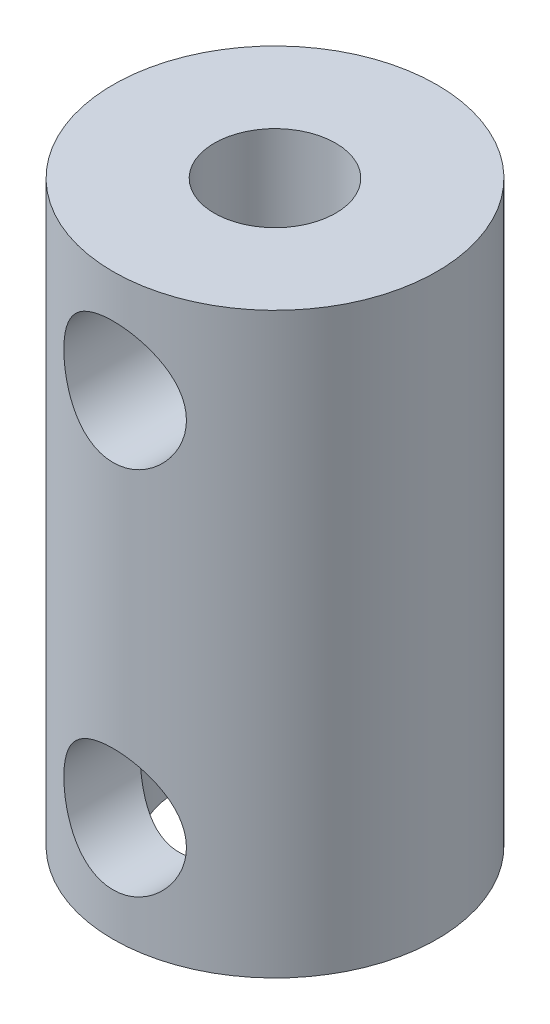
ISO-10303-21;
HEADER;
FILE_DESCRIPTION(('STEP AP214'),'2;1');
FILE_NAME('part.step','',(''),(''),'','','');
FILE_SCHEMA(('AUTOMOTIVE_DESIGN { 1 0 10303 214 1 1 1 1 }'));
ENDSEC;
DATA;
#1=APPLICATION_CONTEXT('core data for automotive mechanical design processes');
#2=APPLICATION_PROTOCOL_DEFINITION('international standard','automotive_design',2000,#1);
#3=PRODUCT_CONTEXT('',#1,'mechanical');
#4=PRODUCT('Part','Part','',(#3));
#5=PRODUCT_RELATED_PRODUCT_CATEGORY('part','',(#4));
#6=PRODUCT_DEFINITION_FORMATION('','',#4);
#7=PRODUCT_DEFINITION_CONTEXT('part definition',#1,'design');
#8=PRODUCT_DEFINITION('design','',#6,#7);
#9=PRODUCT_DEFINITION_SHAPE('','',#8);
#10=(LENGTH_UNIT() NAMED_UNIT(*) SI_UNIT(.MILLI.,.METRE.));
#11=(NAMED_UNIT(*) PLANE_ANGLE_UNIT() SI_UNIT($,.RADIAN.));
#12=(NAMED_UNIT(*) SI_UNIT($,.STERADIAN.) SOLID_ANGLE_UNIT());
#13=UNCERTAINTY_MEASURE_WITH_UNIT(LENGTH_MEASURE(1.E-05),#10,'distance_accuracy_value','');
#14=(GEOMETRIC_REPRESENTATION_CONTEXT(3) GLOBAL_UNCERTAINTY_ASSIGNED_CONTEXT((#13)) GLOBAL_UNIT_ASSIGNED_CONTEXT((#10,
#11,#12)) REPRESENTATION_CONTEXT('',''));
#15=CARTESIAN_POINT('',(0.,0.,0.));
#16=DIRECTION('',(0.,0.,1.));
#17=DIRECTION('',(1.,0.,0.));
#18=AXIS2_PLACEMENT_3D('',#15,#16,#17);
#19=CARTESIAN_POINT('',(0.,19.05,0.));
#20=DIRECTION('',(0.,-1.,0.));
#21=DIRECTION('',(0.,0.,-1.));
#22=AXIS2_PLACEMENT_3D('',#19,#20,#21);
#23=CYLINDRICAL_SURFACE('',#22,5.334);
#24=CARTESIAN_POINT('',(2.0193,3.429,4.93700146951569));
#25=CARTESIAN_POINT('',(2.01930447944566,3.53796644205671,4.93699724405046));
#26=CARTESIAN_POINT('',(2.01045059439056,3.64690370553361,4.94064814854933));
#27=CARTESIAN_POINT('',(1.97543444054488,3.86148882864372,4.95475201963925));
#28=CARTESIAN_POINT('',(1.94927294682313,3.96713683535452,4.96520468163385));
#29=CARTESIAN_POINT('',(1.8807430461981,4.17198278347489,4.99156194094387));
#30=CARTESIAN_POINT('',(1.83841414033231,4.2711957615293,5.00745324054417));
#31=CARTESIAN_POINT('',(1.73889128334471,4.46115102344321,5.04287560500619));
#32=CARTESIAN_POINT('',(1.6816927775262,4.55189070025616,5.06240778458366));
#33=CARTESIAN_POINT('',(1.5509500788627,4.7269220295397,5.10401994332031));
#34=CARTESIAN_POINT('',(1.47677408325426,4.81072382075372,5.12617585427608));
#35=CARTESIAN_POINT('',(1.31552180232293,4.96504478705856,5.16990629793248));
#36=CARTESIAN_POINT('',(1.22844270450761,5.0355610586704,5.19148070266726));
#37=CARTESIAN_POINT('',(1.04012523794396,5.16368183766763,5.23252204526853));
#38=CARTESIAN_POINT('',(0.938499803257829,5.22075210244006,5.25188961400418));
#39=CARTESIAN_POINT('',(0.72622742315813,5.31678227445568,5.28542063488425));
#40=CARTESIAN_POINT('',(0.615583687488669,5.35574859235797,5.29958592879611));
#41=CARTESIAN_POINT('',(0.3935667495427,5.41274137724498,5.32057718322424));
#42=CARTESIAN_POINT('',(0.282438553669901,5.43161158643117,5.32769789450094));
#43=CARTESIAN_POINT('',(0.0583798398278742,5.45058184692518,5.33485652895422));
#44=CARTESIAN_POINT('',(-0.0545500684528995,5.45068811853214,5.33489679931724));
#45=CARTESIAN_POINT('',(-0.272951762873949,5.43261481136873,5.32807636219455));
#46=CARTESIAN_POINT('',(-0.378512558081564,5.41535666378982,5.32156339727964));
#47=CARTESIAN_POINT('',(-0.585111251091151,5.36459681820008,5.30282614548132));
#48=CARTESIAN_POINT('',(-0.686148827388544,5.33109396753274,5.29060145331974));
#49=CARTESIAN_POINT('',(-0.882591199788235,5.24837714092317,5.26142589156488));
#50=CARTESIAN_POINT('',(-0.977891853376846,5.19894029486581,5.24440843901689));
#51=CARTESIAN_POINT('',(-1.15908281530852,5.08595760716204,5.20736477295068));
#52=CARTESIAN_POINT('',(-1.24497004337341,5.02240716770396,5.18733757963256));
#53=CARTESIAN_POINT('',(-1.41031734945089,4.87858128309123,5.1449273066577));
#54=CARTESIAN_POINT('',(-1.48909060289719,4.79753549367529,5.12247495361345));
#55=CARTESIAN_POINT('',(-1.63218972233639,4.623255776233,5.07869327063848));
#56=CARTESIAN_POINT('',(-1.69651181554814,4.53001867543433,5.05736423508365));
#57=CARTESIAN_POINT('',(-1.81023010786301,4.33124303399592,5.01780263958017));
#58=CARTESIAN_POINT('',(-1.85924901990288,4.22547089829707,4.99965257367589));
#59=CARTESIAN_POINT('',(-1.93851753880742,4.00630460921826,4.96945937974622));
#60=CARTESIAN_POINT('',(-1.96877783080307,3.89291483581017,4.95741277583278));
#61=CARTESIAN_POINT('',(-2.0080927254921,3.66852916571396,4.94161372576154));
#62=CARTESIAN_POINT('',(-2.01824049485177,3.55775511724918,4.93743437273379));
#63=CARTESIAN_POINT('',(-2.02020093934924,3.33603239846786,4.93663342024542));
#64=CARTESIAN_POINT('',(-2.01201832383527,3.22508378031911,4.94000987958409));
#65=CARTESIAN_POINT('',(-1.97854205652086,3.01183186914766,4.95350589275915));
#66=CARTESIAN_POINT('',(-1.95410194104481,2.90937078397479,4.96328872527596));
#67=CARTESIAN_POINT('',(-1.88988298600506,2.71005348440489,4.98809328378994));
#68=CARTESIAN_POINT('',(-1.85010096750629,2.61319843639933,5.00311609548081));
#69=CARTESIAN_POINT('',(-1.75463072385412,2.42375373533398,5.03740860205378));
#70=CARTESIAN_POINT('',(-1.69839621410485,2.3314653892027,5.05681781536739));
#71=CARTESIAN_POINT('',(-1.57219523321136,2.15724747101338,5.09746480725639));
#72=CARTESIAN_POINT('',(-1.50222365366067,2.07532177120689,5.11870326441882));
#73=CARTESIAN_POINT('',(-1.34516894631352,1.91864380219287,5.16227937258416));
#74=CARTESIAN_POINT('',(-1.25727058071108,1.84470087388889,5.18459902436317));
#75=CARTESIAN_POINT('',(-1.06976739053701,1.71251372859964,5.22650650196036));
#76=CARTESIAN_POINT('',(-0.970162473418251,1.65426963573486,5.24609430617899));
#77=CARTESIAN_POINT('',(-0.762084546055987,1.55549649159357,5.28032694944767));
#78=CARTESIAN_POINT('',(-0.653639678197273,1.51491364331945,5.29498676788629));
#79=CARTESIAN_POINT('',(-0.430779322695867,1.45280032542776,5.31775366325145));
#80=CARTESIAN_POINT('',(-0.316366729446468,1.43126070903252,5.32586388589444));
#81=CARTESIAN_POINT('',(-0.0921269840688091,1.40884562792457,5.33431446661301));
#82=CARTESIAN_POINT('',(0.0175700260696708,1.40682107157147,5.33508685186249));
#83=CARTESIAN_POINT('',(0.235675890355793,1.42052681410102,5.32990684279753));
#84=CARTESIAN_POINT('',(0.344084903230244,1.43625490180729,5.32395528598201));
#85=CARTESIAN_POINT('',(0.553754325491233,1.48421010250464,5.3061959436016));
#86=CARTESIAN_POINT('',(0.65512610504446,1.5160107376975,5.29453976881732));
#87=CARTESIAN_POINT('',(0.85109980467382,1.594780504935,5.26659215506921));
#88=CARTESIAN_POINT('',(0.945700438435497,1.64175250979097,5.2502998382871));
#89=CARTESIAN_POINT('',(1.12984126460486,1.75179421046231,5.21384686801513));
#90=CARTESIAN_POINT('',(1.21899691290268,1.81546192263802,5.19355150342232));
#91=CARTESIAN_POINT('',(1.38571137675006,1.9561510808879,5.15157869080139));
#92=CARTESIAN_POINT('',(1.46326600313847,2.03317732918966,5.1299007475314));
#93=CARTESIAN_POINT('',(1.60889417238223,2.20334295835457,5.08616858438968));
#94=CARTESIAN_POINT('',(1.67622898493519,2.29712810269221,5.06415732477682));
#95=CARTESIAN_POINT('',(1.79422016325732,2.49537615296483,5.02356822261871));
#96=CARTESIAN_POINT('',(1.84487417660335,2.59984056223187,5.0049908645041));
#97=CARTESIAN_POINT('',(1.92989734602869,2.82239312636753,4.97285117373348));
#98=CARTESIAN_POINT('',(1.96328114135574,2.94090744590317,4.9596003647767));
#99=CARTESIAN_POINT('',(2.00797225124147,3.18262915575414,4.94168088836879));
#100=CARTESIAN_POINT('',(2.01929493679982,3.30583321744351,4.9370062456371));
#101=CARTESIAN_POINT('',(2.0193,3.429,4.93700146951569));
#102=B_SPLINE_CURVE_WITH_KNOTS('',3,(#24,#25,#26,#27,#28,#29,#30,#31,#32,#33,#34,#35,#36,#37,
#38,#39,#40,#41,#42,#43,#44,#45,#46,#47,#48,#49,#50,#51,#52,#53,#54,#55,#56,#57,#58,#59,#60,#61,
#62,#63,#64,#65,#66,#67,#68,#69,#70,#71,#72,#73,#74,#75,#76,#77,#78,#79,#80,#81,#82,#83,#84,#85,
#86,#87,#88,#89,#90,#91,#92,#93,#94,#95,#96,#97,#98,#99,#100,#101),.UNSPECIFIED.,.T.,.F.,(4,2,2,
2,2,2,2,2,2,2,2,2,2,2,2,2,2,2,2,2,2,2,2,2,2,2,2,2,2,2,2,2,2,2,2,2,2,2,4),(0.,0.326440462933107,
0.652866308208244,0.978499662966163,1.30423288001533,1.64497726295524,1.98579602758814,
2.33846601182068,2.69101101924979,3.02808777213957,3.36505278290879,3.68503301877184,
4.00503596242416,4.32972461584071,4.65451919925019,4.9986458272,5.3428621925583,
5.69499486283584,6.0469267694459,6.37913973630184,6.71126736249902,7.02720512429604,
7.34320838551137,7.6712024554679,7.99931872846167,8.34870603281661,8.6980960994686,
9.04641432838321,9.39456516328479,9.72208120206035,10.0495564516543,10.3687657960398,
10.6880356205532,11.0208403418839,11.3537649513074,11.7046787209908,12.0556419573988,
12.4248810015916,12.793862687667),.UNSPECIFIED.);
#103=CARTESIAN_POINT('',(2.0193,3.429,4.93700146951569));
#104=VERTEX_POINT('',#103);
#105=EDGE_CURVE('E91',#104,#104,#102,.T.);
#106=ORIENTED_EDGE('',*,*,#105,.F.);
#107=EDGE_LOOP('',(#106));
#108=FACE_BOUND('',#107,.T.);
#109=CARTESIAN_POINT('',(2.0193,15.621,4.93700146951569));
#110=CARTESIAN_POINT('',(2.01930447944566,15.7299664420567,4.93699724405046));
#111=CARTESIAN_POINT('',(2.01045059439057,15.8389037055336,4.94064814854933));
#112=CARTESIAN_POINT('',(1.97543444054489,16.0534888286437,4.95475201963925));
#113=CARTESIAN_POINT('',(1.94927294682312,16.1591368353545,4.96520468163385));
#114=CARTESIAN_POINT('',(1.88074304619809,16.3639827834749,4.99156194094387));
#115=CARTESIAN_POINT('',(1.83841414033231,16.4631957615293,5.00745324054417));
#116=CARTESIAN_POINT('',(1.73889128334471,16.6531510234432,5.04287560500619));
#117=CARTESIAN_POINT('',(1.6816927775262,16.7438907002562,5.06240778458366));
#118=CARTESIAN_POINT('',(1.5509500788627,16.9189220295397,5.10401994332031));
#119=CARTESIAN_POINT('',(1.47677408325426,17.0027238207537,5.12617585427608));
#120=CARTESIAN_POINT('',(1.31552180232293,17.1570447870586,5.16990629793248));
#121=CARTESIAN_POINT('',(1.22844270450761,17.2275610586704,5.19148070266726));
#122=CARTESIAN_POINT('',(1.04012523794396,17.3556818376676,5.23252204526853));
#123=CARTESIAN_POINT('',(0.938499803257829,17.41275210244,5.25188961400418));
#124=CARTESIAN_POINT('',(0.72622742315813,17.5087822744557,5.28542063488425));
#125=CARTESIAN_POINT('',(0.615583687488669,17.547748592358,5.29958592879611));
#126=CARTESIAN_POINT('',(0.393566749542701,17.604741377245,5.32057718322424));
#127=CARTESIAN_POINT('',(0.282438553669903,17.6236115864312,5.32769789450094));
#128=CARTESIAN_POINT('',(0.0583798398278784,17.6425818469252,5.33485652895422));
#129=CARTESIAN_POINT('',(-0.0545500684528942,17.6426881185321,5.33489679931724));
#130=CARTESIAN_POINT('',(-0.272951762873941,17.6246148113687,5.32807636219455));
#131=CARTESIAN_POINT('',(-0.378512558081556,17.6073566637898,5.32156339727964));
#132=CARTESIAN_POINT('',(-0.585111251091143,17.5565968182001,5.30282614548132));
#133=CARTESIAN_POINT('',(-0.686148827388537,17.5230939675327,5.29060145331974));
#134=CARTESIAN_POINT('',(-0.882591199788228,17.4403771409232,5.26142589156488));
#135=CARTESIAN_POINT('',(-0.977891853376836,17.3909402948658,5.2444084390169));
#136=CARTESIAN_POINT('',(-1.15908281530851,17.277957607162,5.20736477295068));
#137=CARTESIAN_POINT('',(-1.24497004337341,17.214407167704,5.18733757963256));
#138=CARTESIAN_POINT('',(-1.41031734945088,17.0705812830912,5.1449273066577));
#139=CARTESIAN_POINT('',(-1.48909060289718,16.9895354936753,5.12247495361345));
#140=CARTESIAN_POINT('',(-1.63218972233638,16.815255776233,5.07869327063848));
#141=CARTESIAN_POINT('',(-1.69651181554813,16.7220186754343,5.05736423508365));
#142=CARTESIAN_POINT('',(-1.810230107863,16.5232430339959,5.01780263958017));
#143=CARTESIAN_POINT('',(-1.85924901990287,16.4174708982971,4.9996525736759));
#144=CARTESIAN_POINT('',(-1.9385175388074,16.1983046092183,4.96945937974623));
#145=CARTESIAN_POINT('',(-1.96877783080306,16.0849148358102,4.95741277583277));
#146=CARTESIAN_POINT('',(-2.00809272549209,15.860529165714,4.94161372576153));
#147=CARTESIAN_POINT('',(-2.01824049485176,15.7497551172492,4.9374343727338));
#148=CARTESIAN_POINT('',(-2.02020093934923,15.5280323984679,4.93663342024543));
#149=CARTESIAN_POINT('',(-2.01201832383527,15.4170837803191,4.94000987958409));
#150=CARTESIAN_POINT('',(-1.97854205652086,15.2038318691477,4.95350589275915));
#151=CARTESIAN_POINT('',(-1.95410194104481,15.1013707839748,4.96328872527596));
#152=CARTESIAN_POINT('',(-1.88988298600505,14.9020534844049,4.98809328378995));
#153=CARTESIAN_POINT('',(-1.85010096750628,14.8051984363993,5.00311609548082));
#154=CARTESIAN_POINT('',(-1.75463072385411,14.615753735334,5.03740860205378));
#155=CARTESIAN_POINT('',(-1.69839621410485,14.5234653892027,5.05681781536739));
#156=CARTESIAN_POINT('',(-1.57219523321136,14.3492474710134,5.09746480725639));
#157=CARTESIAN_POINT('',(-1.50222365366066,14.2673217712069,5.11870326441882));
#158=CARTESIAN_POINT('',(-1.34516894631352,14.1106438021929,5.16227937258415));
#159=CARTESIAN_POINT('',(-1.25727058071108,14.0367008738889,5.18459902436317));
#160=CARTESIAN_POINT('',(-1.06976739053702,13.9045137285996,5.22650650196036));
#161=CARTESIAN_POINT('',(-0.97016247341825,13.8462696357349,5.24609430617899));
#162=CARTESIAN_POINT('',(-0.762084546055986,13.7474964915936,5.28032694944767));
#163=CARTESIAN_POINT('',(-0.653639678197273,13.7069136433194,5.29498676788628));
#164=CARTESIAN_POINT('',(-0.430779322695865,13.6448003254278,5.31775366325145));
#165=CARTESIAN_POINT('',(-0.316366729446463,13.6232607090325,5.32586388589444));
#166=CARTESIAN_POINT('',(-0.0921269840688006,13.6008456279246,5.33431446661301));
#167=CARTESIAN_POINT('',(0.01757002606968,13.5988210715715,5.33508685186249));
#168=CARTESIAN_POINT('',(0.235675890355801,13.612526814101,5.32990684279753));
#169=CARTESIAN_POINT('',(0.344084903230251,13.6282549018073,5.32395528598201));
#170=CARTESIAN_POINT('',(0.55375432549124,13.6762101025046,5.3061959436016));
#171=CARTESIAN_POINT('',(0.655126105044469,13.7080107376975,5.29453976881732));
#172=CARTESIAN_POINT('',(0.85109980467383,13.786780504935,5.26659215506921));
#173=CARTESIAN_POINT('',(0.945700438435504,13.833752509791,5.25029983828711));
#174=CARTESIAN_POINT('',(1.12984126460487,13.9437942104623,5.21384686801514));
#175=CARTESIAN_POINT('',(1.21899691290269,14.007461922638,5.19355150342232));
#176=CARTESIAN_POINT('',(1.38571137675007,14.1481510808879,5.15157869080139));
#177=CARTESIAN_POINT('',(1.46326600313847,14.2251773291897,5.1299007475314));
#178=CARTESIAN_POINT('',(1.60889417238223,14.3953429583546,5.08616858438968));
#179=CARTESIAN_POINT('',(1.6762289849352,14.4891281026922,5.06415732477682));
#180=CARTESIAN_POINT('',(1.79422016325732,14.6873761529648,5.0235682226187));
#181=CARTESIAN_POINT('',(1.84487417660335,14.7918405622319,5.0049908645041));
#182=CARTESIAN_POINT('',(1.92989734602869,15.0143931263675,4.97285117373349));
#183=CARTESIAN_POINT('',(1.96328114135574,15.1329074459032,4.9596003647767));
#184=CARTESIAN_POINT('',(2.00797225124147,15.3746291557541,4.94168088836878));
#185=CARTESIAN_POINT('',(2.01929493679982,15.4978332174435,4.9370062456371));
#186=CARTESIAN_POINT('',(2.0193,15.621,4.93700146951569));
#187=B_SPLINE_CURVE_WITH_KNOTS('',3,(#109,#110,#111,#112,#113,#114,#115,#116,#117,#118,#119,
#120,#121,#122,#123,#124,#125,#126,#127,#128,#129,#130,#131,#132,#133,#134,#135,#136,#137,#138,
#139,#140,#141,#142,#143,#144,#145,#146,#147,#148,#149,#150,#151,#152,#153,#154,#155,#156,#157,
#158,#159,#160,#161,#162,#163,#164,#165,#166,#167,#168,#169,#170,#171,#172,#173,#174,#175,#176,
#177,#178,#179,#180,#181,#182,#183,#184,#185,#186),.UNSPECIFIED.,.T.,.F.,(4,2,2,2,2,2,2,2,2,2,2,
2,2,2,2,2,2,2,2,2,2,2,2,2,2,2,2,2,2,2,2,2,2,2,2,2,2,2,4),(0.,0.326440462933105,
0.652866308208246,0.978499662966168,1.30423288001533,1.64497726295524,1.98579602758814,
2.33846601182068,2.69101101924979,3.02808777213956,3.36505278290879,3.68503301877183,
4.00503596242416,4.3297246158407,4.65451919925018,4.99864582719998,5.34286219255828,
5.69499486283583,6.04692676944589,6.37913973630183,6.71126736249899,7.02720512429603,
7.34320838551137,7.67120245546788,7.99931872846165,8.34870603281659,8.69809609946858,
9.04641432838319,9.39456516328478,9.72208120206033,10.0495564516543,10.3687657960398,
10.6880356205532,11.0208403418838,11.3537649513074,11.7046787209907,12.0556419573988,
12.4248810015916,12.793862687667),.UNSPECIFIED.);
#188=CARTESIAN_POINT('',(2.0193,15.621,4.93700146951569));
#189=VERTEX_POINT('',#188);
#190=EDGE_CURVE('E120',#189,#189,#187,.T.);
#191=ORIENTED_EDGE('',*,*,#190,.F.);
#192=EDGE_LOOP('',(#191));
#193=FACE_BOUND('',#192,.T.);
#194=CARTESIAN_POINT('',(0.,19.05,0.));
#195=DIRECTION('',(0.,-1.,0.));
#196=DIRECTION('',(0.,0.,-1.));
#197=AXIS2_PLACEMENT_3D('',#194,#195,#196);
#198=CIRCLE('',#197,5.334);
#199=CARTESIAN_POINT('',(0.,19.05,-5.334));
#200=VERTEX_POINT('',#199);
#201=EDGE_CURVE('E87',#200,#200,#198,.T.);
#202=ORIENTED_EDGE('',*,*,#201,.T.);
#203=EDGE_LOOP('',(#202));
#204=FACE_BOUND('',#203,.T.);
#205=CARTESIAN_POINT('',(0.,0.,0.));
#206=DIRECTION('',(0.,-1.,0.));
#207=DIRECTION('',(0.,0.,-1.));
#208=AXIS2_PLACEMENT_3D('',#205,#206,#207);
#209=CIRCLE('',#208,5.334);
#210=CARTESIAN_POINT('',(0.,0.,-5.334));
#211=VERTEX_POINT('',#210);
#212=EDGE_CURVE('E143',#211,#211,#209,.T.);
#213=ORIENTED_EDGE('',*,*,#212,.F.);
#214=EDGE_LOOP('',(#213));
#215=FACE_BOUND('',#214,.T.);
#216=ADVANCED_FACE('F42',(#108,#193,#204,#215),#23,.T.);
#217=CARTESIAN_POINT('',(5.334,19.05,0.));
#218=DIRECTION('',(0.,1.,0.));
#219=DIRECTION('',(0.,0.,1.));
#220=AXIS2_PLACEMENT_3D('',#217,#218,#219);
#221=PLANE('',#220);
#222=CARTESIAN_POINT('',(0.,19.05,0.));
#223=DIRECTION('',(0.,-1.,0.));
#224=DIRECTION('',(0.,0.,-1.));
#225=AXIS2_PLACEMENT_3D('',#222,#223,#224);
#226=CIRCLE('',#225,2.);
#227=CARTESIAN_POINT('',(0.,19.05,-2.));
#228=VERTEX_POINT('',#227);
#229=EDGE_CURVE('E140',#228,#228,#226,.T.);
#230=ORIENTED_EDGE('',*,*,#229,.T.);
#231=EDGE_LOOP('',(#230));
#232=FACE_BOUND('',#231,.T.);
#233=ORIENTED_EDGE('',*,*,#201,.F.);
#234=EDGE_LOOP('',(#233));
#235=FACE_BOUND('',#234,.T.);
#236=ADVANCED_FACE('F154',(#232,#235),#221,.T.);
#237=CARTESIAN_POINT('',(0.,0.,0.));
#238=DIRECTION('',(0.,-1.,0.));
#239=DIRECTION('',(0.,0.,-1.));
#240=AXIS2_PLACEMENT_3D('',#237,#238,#239);
#241=PLANE('',#240);
#242=CARTESIAN_POINT('',(0.,0.,0.));
#243=DIRECTION('',(0.,-1.,0.));
#244=DIRECTION('',(0.,0.,-1.));
#245=AXIS2_PLACEMENT_3D('',#242,#243,#244);
#246=CIRCLE('',#245,3.17499999999999);
#247=CARTESIAN_POINT('',(0.,0.,-3.17499999999999));
#248=VERTEX_POINT('',#247);
#249=EDGE_CURVE('E127',#248,#248,#246,.T.);
#250=ORIENTED_EDGE('',*,*,#249,.F.);
#251=EDGE_LOOP('',(#250));
#252=FACE_BOUND('',#251,.T.);
#253=ORIENTED_EDGE('',*,*,#212,.T.);
#254=EDGE_LOOP('',(#253));
#255=FACE_BOUND('',#254,.T.);
#256=ADVANCED_FACE('F156',(#252,#255),#241,.T.);
#257=CARTESIAN_POINT('',(0.,0.,0.));
#258=DIRECTION('',(0.,-1.,0.));
#259=DIRECTION('',(0.,0.,-1.));
#260=AXIS2_PLACEMENT_3D('',#257,#258,#259);
#261=CYLINDRICAL_SURFACE('',#260,2.00000000000001);
#262=DIRECTION('',(0.,-1.,0.));
#263=VECTOR('',#262,1.);
#264=CARTESIAN_POINT('',(-2.,0.,0.));
#265=LINE('',#264,#263);
#266=CARTESIAN_POINT('',(-1.99999999999999,15.8995183835942,0.));
#267=VERTEX_POINT('',#266);
#268=CARTESIAN_POINT('',(-1.99999999999999,15.3424816164058,0.));
#269=VERTEX_POINT('',#268);
#270=EDGE_CURVE('E86',#267,#269,#265,.T.);
#271=ORIENTED_EDGE('',*,*,#270,.T.);
#272=CARTESIAN_POINT('',(-1.99999999999999,15.3424816164058,0.));
#273=CARTESIAN_POINT('',(-2.00000748831822,15.342587271666,0.0192077634751876));
#274=CARTESIAN_POINT('',(-1.9997243945891,15.3404974577202,0.0382328395349654));
#275=CARTESIAN_POINT('',(-1.99866755441006,15.3330384444102,0.0751799827838716));
#276=CARTESIAN_POINT('',(-1.99790543999761,15.3277470984996,0.0931174412164273));
#277=CARTESIAN_POINT('',(-1.99485746057193,15.3074823773858,0.148286783167819));
#278=CARTESIAN_POINT('',(-1.99182861163326,15.2883879226125,0.183849680609768));
#279=CARTESIAN_POINT('',(-1.98426929244277,15.2458434932975,0.252780344942273));
#280=CARTESIAN_POINT('',(-1.97970824187665,15.2223094867289,0.286085302255442));
#281=CARTESIAN_POINT('',(-1.96911335877789,15.172874016039,0.351729844098035));
#282=CARTESIAN_POINT('',(-1.96305176914157,15.1469344774164,0.384036574645022));
#283=CARTESIAN_POINT('',(-1.94954358636357,15.0941221923492,0.447586887168161));
#284=CARTESIAN_POINT('',(-1.94209608887332,15.0672488459313,0.47882975910476));
#285=CARTESIAN_POINT('',(-1.91766272931993,14.9859088355922,0.571549324042008));
#286=CARTESIAN_POINT('',(-1.89860114147255,14.9307960516994,0.631925909200008));
#287=CARTESIAN_POINT('',(-1.85498638337458,14.8209453888143,0.750311764928943));
#288=CARTESIAN_POINT('',(-1.83046495388365,14.7662071555184,0.808332514384589));
#289=CARTESIAN_POINT('',(-1.77571877659275,14.6576264974823,0.92240111657699));
#290=CARTESIAN_POINT('',(-1.74549870522666,14.6037833773399,0.978450542590948));
#291=CARTESIAN_POINT('',(-1.67884853394249,14.4971570314943,1.08887772520683));
#292=CARTESIAN_POINT('',(-1.64237059897694,14.444385760751,1.14323848139825));
#293=CARTESIAN_POINT('',(-1.56315103636863,14.3410066139392,1.24938164321234));
#294=CARTESIAN_POINT('',(-1.52040676394172,14.2903996630555,1.30116294772112));
#295=CARTESIAN_POINT('',(-1.38247778031107,14.1430405024795,1.45162211365199));
#296=CARTESIAN_POINT('',(-1.27736716309543,14.0503661508649,1.54581021002994));
#297=CARTESIAN_POINT('',(-1.08814511089191,13.9177852433471,1.68030753313403));
#298=CARTESIAN_POINT('',(-1.01279273609853,13.8717166299401,1.72698046896826));
#299=CARTESIAN_POINT('',(-0.85269727011424,13.7883513458444,1.81137325333855));
#300=CARTESIAN_POINT('',(-0.767960780205621,13.7510485657521,1.84909933760977));
#301=CARTESIAN_POINT('',(-0.589342936559108,13.6872667277984,1.91357622366881));
#302=CARTESIAN_POINT('',(-0.495374516107187,13.6609060433235,1.94020700556301));
#303=CARTESIAN_POINT('',(-0.301829106896712,13.6219581332061,1.97954636705079));
#304=CARTESIAN_POINT('',(-0.202259824195108,13.6093524473856,1.99227360620528));
#305=CARTESIAN_POINT('',(-0.0165737953527124,13.5999539335568,2.00176294174565));
#306=CARTESIAN_POINT('',(0.0693393795394252,13.6010867376299,2.00061937971779));
#307=CARTESIAN_POINT('',(0.239480596384862,13.6141378547581,1.98744158063111));
#308=CARTESIAN_POINT('',(0.323708726173339,13.6260556041288,1.97540791275306));
#309=CARTESIAN_POINT('',(0.483518112448736,13.6588375976378,1.94229604141942));
#310=CARTESIAN_POINT('',(0.559320439566745,13.6791787564111,1.92174661196922));
#311=CARTESIAN_POINT('',(0.705790095057259,13.727487450853,1.87292008503527));
#312=CARTESIAN_POINT('',(0.776455639693814,13.7554576198069,1.84464031928429));
#313=CARTESIAN_POINT('',(0.940455995761938,13.830931464341,1.7682817701587));
#314=CARTESIAN_POINT('',(1.03075165062372,13.8816948996274,1.71688631336408));
#315=CARTESIAN_POINT('',(1.19850532971888,13.9927090019766,1.60432032335271));
#316=CARTESIAN_POINT('',(1.27593463286973,14.0529803241363,1.54312850395108));
#317=CARTESIAN_POINT('',(1.44503742040652,14.2044099786752,1.38904372124749));
#318=CARTESIAN_POINT('',(1.53103298904051,14.2986321884123,1.29291066556784));
#319=CARTESIAN_POINT('',(1.64308682211231,14.4455652201976,1.1420161031596));
#320=CARTESIAN_POINT('',(1.6776439697679,14.4955351947379,1.09054077679252));
#321=CARTESIAN_POINT('',(1.74134672627516,14.5968619144876,0.985634221691187));
#322=CARTESIAN_POINT('',(1.77049398667466,14.6482182309679,0.932203595860018));
#323=CARTESIAN_POINT('',(1.81713565077218,14.739219708464,0.836730312591955));
#324=CARTESIAN_POINT('',(1.83574345674735,14.7786934351685,0.795058568758477));
#325=CARTESIAN_POINT('',(1.87002880929561,14.857834086355,0.710681090115651));
#326=CARTESIAN_POINT('',(1.88570574367889,14.8975010494281,0.667975141384794));
#327=CARTESIAN_POINT('',(1.91413894714902,14.97648203236,0.581496882574795));
#328=CARTESIAN_POINT('',(1.92690238637382,15.0157966848282,0.537727490212924));
#329=CARTESIAN_POINT('',(1.94958114684418,15.0934344072027,0.448616973422525));
#330=CARTESIAN_POINT('',(1.95949852629816,15.1317581753521,0.403277011524337));
#331=CARTESIAN_POINT('',(1.97277362889247,15.1894892320285,0.32997977941102));
#332=CARTESIAN_POINT('',(1.97711241488193,15.2099029944993,0.302995132253033));
#333=CARTESIAN_POINT('',(1.98482505218745,15.2489358146375,0.247506020198399));
#334=CARTESIAN_POINT('',(1.98819764959178,15.2675525195204,0.218999636781018));
#335=CARTESIAN_POINT('',(1.99282475383879,15.2948997370007,0.170329630728768));
#336=CARTESIAN_POINT('',(1.9944047067489,15.3047768044837,0.150856173469314));
#337=CARTESIAN_POINT('',(1.99702870184641,15.3217970735771,0.11079128176629));
#338=CARTESIAN_POINT('',(1.99807638915548,15.3289587825933,0.0902085493917273));
#339=CARTESIAN_POINT('',(1.9991946966965,15.3367442614378,0.0578519042516144));
#340=CARTESIAN_POINT('',(1.99949311852767,15.3388594043234,0.0464499657473986));
#341=CARTESIAN_POINT('',(1.9998974216306,15.341744795786,0.0233737220268201));
#342=CARTESIAN_POINT('',(2.00000156481852,15.3425029014292,0.0116978956015704));
#343=CARTESIAN_POINT('',(2.00000000000001,15.3424816164058,0.));
#344=B_SPLINE_CURVE_WITH_KNOTS('',3,(#272,#273,#274,#275,#276,#277,#278,#279,#280,#281,#282,
#283,#284,#285,#286,#287,#288,#289,#290,#291,#292,#293,#294,#295,#296,#297,#298,#299,#300,#301,
#302,#303,#304,#305,#306,#307,#308,#309,#310,#311,#312,#313,#314,#315,#316,#317,#318,#319,#320,
#321,#322,#323,#324,#325,#326,#327,#328,#329,#330,#331,#332,#333,#334,#335,#336,#337,#338,#339,
#340,#341,#342,#343),.UNSPECIFIED.,.F.,.F.,(4,2,2,2,2,2,2,2,2,2,2,2,2,2,2,2,2,2,2,2,2,2,2,2,2,2,
2,2,2,2,2,2,2,2,2,4),(0.,0.0572212196873636,0.113103945109736,0.233594332403711,
0.356648526209319,0.482175813106861,0.607785299579433,0.859357941597184,1.10950457759485,
1.35944682397225,1.61139248897477,1.86344479850475,2.36578118786238,2.66449162617641,
2.96299325474961,3.26464487824174,3.56589116416417,3.82229894685731,4.07869332895043,
4.32111164705779,4.56361374617905,4.90859052703501,5.25432733236246,5.73074334288402,
5.96948577941364,6.20815521156947,6.38910474555767,6.57009203350265,6.75062898909158,
6.93103505336674,7.03333696410983,7.1357710461502,7.20133615895784,7.26644599507595,
7.30116939437312,7.33620197844745),.UNSPECIFIED.);
#345=CARTESIAN_POINT('',(2.00000000000001,15.3424816164058,0.));
#346=VERTEX_POINT('',#345);
#347=EDGE_CURVE('E11',#269,#346,#344,.T.);
#348=ORIENTED_EDGE('',*,*,#347,.T.);
#349=DIRECTION('',(0.,-1.,0.));
#350=VECTOR('',#349,1.);
#351=CARTESIAN_POINT('',(2.,0.,0.));
#352=LINE('',#351,#350);
#353=CARTESIAN_POINT('',(2.00000000000001,15.8995183835942,0.));
#354=VERTEX_POINT('',#353);
#355=EDGE_CURVE('E57',#346,#354,#352,.F.);
#356=ORIENTED_EDGE('',*,*,#355,.T.);
#357=CARTESIAN_POINT('',(2.00000000000001,15.8995183835942,0.));
#358=CARTESIAN_POINT('',(2.00000748831821,15.8994127283341,0.0192077634751675));
#359=CARTESIAN_POINT('',(1.9997243945891,15.9015025422799,0.0382328395349459));
#360=CARTESIAN_POINT('',(1.99866755441007,15.9089615555899,0.0751799827838645));
#361=CARTESIAN_POINT('',(1.99790543999763,15.9142529015004,0.0931174412164318));
#362=CARTESIAN_POINT('',(1.99485746057196,15.9345176226142,0.14828678316783));
#363=CARTESIAN_POINT('',(1.99182861163327,15.9536120773876,0.183849680609743));
#364=CARTESIAN_POINT('',(1.98426929244276,15.9961565067026,0.25278034494224));
#365=CARTESIAN_POINT('',(1.97970824187666,16.0196905132711,0.286085302255439));
#366=CARTESIAN_POINT('',(1.96911335877791,16.069125983961,0.351729844098036));
#367=CARTESIAN_POINT('',(1.96305176914158,16.0950655225836,0.384036574644996));
#368=CARTESIAN_POINT('',(1.94954358636358,16.1478778076508,0.447586887168114));
#369=CARTESIAN_POINT('',(1.94209608887333,16.1747511540687,0.478829759104721));
#370=CARTESIAN_POINT('',(1.91766272931994,16.2560911644078,0.571549324041987));
#371=CARTESIAN_POINT('',(1.89860114147256,16.3112039483006,0.631925909199987));
#372=CARTESIAN_POINT('',(1.85498638337458,16.4210546111857,0.750311764928928));
#373=CARTESIAN_POINT('',(1.83046495388365,16.4757928444816,0.808332514384579));
#374=CARTESIAN_POINT('',(1.77571877659275,16.5843735025177,0.922401116576983));
#375=CARTESIAN_POINT('',(1.74549870522666,16.6382166226601,0.978450542590941));
#376=CARTESIAN_POINT('',(1.6788485339425,16.7448429685057,1.08887772520683));
#377=CARTESIAN_POINT('',(1.64237059897695,16.797614239249,1.14323848139825));
#378=CARTESIAN_POINT('',(1.56315103636863,16.9009933860608,1.24938164321234));
#379=CARTESIAN_POINT('',(1.52040676394173,16.9516003369445,1.30116294772112));
#380=CARTESIAN_POINT('',(1.38247778031108,17.0989594975205,1.45162211365199));
#381=CARTESIAN_POINT('',(1.27736716309545,17.1916338491351,1.54581021002994));
#382=CARTESIAN_POINT('',(1.08814511089192,17.3242147566529,1.68030753313403));
#383=CARTESIAN_POINT('',(1.01279273609854,17.3702833700599,1.72698046896826));
#384=CARTESIAN_POINT('',(0.852697270114247,17.4536486541556,1.81137325333854));
#385=CARTESIAN_POINT('',(0.767960780205633,17.4909514342479,1.84909933760977));
#386=CARTESIAN_POINT('',(0.589342936559122,17.5547332722016,1.91357622366881));
#387=CARTESIAN_POINT('',(0.495374516107196,17.5810939566765,1.94020700556301));
#388=CARTESIAN_POINT('',(0.301829106896717,17.6200418667939,1.97954636705079));
#389=CARTESIAN_POINT('',(0.202259824195114,17.6326475526144,1.99227360620528));
#390=CARTESIAN_POINT('',(0.0165737953527205,17.6420460664432,2.00176294174565));
#391=CARTESIAN_POINT('',(-0.0693393795394165,17.6409132623701,2.00061937971779));
#392=CARTESIAN_POINT('',(-0.239480596384855,17.6278621452419,1.98744158063111));
#393=CARTESIAN_POINT('',(-0.323708726173333,17.6159443958712,1.97540791275306));
#394=CARTESIAN_POINT('',(-0.483518112448727,17.5831624023622,1.94229604141942));
#395=CARTESIAN_POINT('',(-0.559320439566733,17.5628212435888,1.92174661196923));
#396=CARTESIAN_POINT('',(-0.705790095057244,17.514512549147,1.87292008503527));
#397=CARTESIAN_POINT('',(-0.776455639693801,17.4865423801931,1.8446403192843));
#398=CARTESIAN_POINT('',(-0.940455995761927,17.4110685356591,1.76828177015871));
#399=CARTESIAN_POINT('',(-1.03075165062371,17.3603051003726,1.71688631336409));
#400=CARTESIAN_POINT('',(-1.19850532971886,17.2492909980234,1.60432032335272));
#401=CARTESIAN_POINT('',(-1.27593463286971,17.1890196758637,1.54312850395108));
#402=CARTESIAN_POINT('',(-1.4450374204065,17.0375900213248,1.38904372124749));
#403=CARTESIAN_POINT('',(-1.5310329890405,16.9433678115877,1.29291066556784));
#404=CARTESIAN_POINT('',(-1.6430868221123,16.7964347798024,1.14201610315962));
#405=CARTESIAN_POINT('',(-1.6776439697679,16.7464648052621,1.09054077679254));
#406=CARTESIAN_POINT('',(-1.74134672627515,16.6451380855124,0.985634221691196));
#407=CARTESIAN_POINT('',(-1.77049398667464,16.5937817690321,0.932203595860016));
#408=CARTESIAN_POINT('',(-1.81713565077217,16.502780291536,0.836730312591957));
#409=CARTESIAN_POINT('',(-1.83574345674734,16.4633065648315,0.79505856875849));
#410=CARTESIAN_POINT('',(-1.87002880929561,16.384165913645,0.710681090115671));
#411=CARTESIAN_POINT('',(-1.88570574367889,16.3444989505719,0.66797514138481));
#412=CARTESIAN_POINT('',(-1.91413894714901,16.26551796764,0.581496882574825));
#413=CARTESIAN_POINT('',(-1.92690238637381,16.2262033151718,0.537727490212971));
#414=CARTESIAN_POINT('',(-1.94958114684417,16.1485655927973,0.448616973422546));
#415=CARTESIAN_POINT('',(-1.95949852629815,16.1102418246479,0.403277011524316));
#416=CARTESIAN_POINT('',(-1.97277362889246,16.0525107679715,0.329979779411034));
#417=CARTESIAN_POINT('',(-1.97711241488193,16.0320970055006,0.302995132253082));
#418=CARTESIAN_POINT('',(-1.98482505218745,15.9930641853625,0.247506020198439));
#419=CARTESIAN_POINT('',(-1.98819764959177,15.9744474804796,0.218999636781013));
#420=CARTESIAN_POINT('',(-1.99282475383878,15.9471002629992,0.17032963072878));
#421=CARTESIAN_POINT('',(-1.9944047067489,15.9372231955162,0.150856173469353));
#422=CARTESIAN_POINT('',(-1.99702870184641,15.9202029264229,0.110791281766321));
#423=CARTESIAN_POINT('',(-1.99807638915547,15.9130412174068,0.0902085493917228));
#424=CARTESIAN_POINT('',(-1.9991946966965,15.9052557385622,0.0578519042516082));
#425=CARTESIAN_POINT('',(-1.99949311852767,15.9031405956765,0.0464499657474026));
#426=CARTESIAN_POINT('',(-1.99989742163061,15.9002552042139,0.0233737220268356));
#427=CARTESIAN_POINT('',(-2.00000156481852,15.8994970985707,0.0116978956015872));
#428=CARTESIAN_POINT('',(-1.99999999999999,15.8995183835942,0.));
#429=B_SPLINE_CURVE_WITH_KNOTS('',3,(#357,#358,#359,#360,#361,#362,#363,#364,#365,#366,#367,
#368,#369,#370,#371,#372,#373,#374,#375,#376,#377,#378,#379,#380,#381,#382,#383,#384,#385,#386,
#387,#388,#389,#390,#391,#392,#393,#394,#395,#396,#397,#398,#399,#400,#401,#402,#403,#404,#405,
#406,#407,#408,#409,#410,#411,#412,#413,#414,#415,#416,#417,#418,#419,#420,#421,#422,#423,#424,
#425,#426,#427,#428),.UNSPECIFIED.,.F.,.F.,(4,2,2,2,2,2,2,2,2,2,2,2,2,2,2,2,2,2,2,2,2,2,2,2,2,2,
2,2,2,2,2,2,2,2,2,4),(0.,0.0572212196873587,0.113103945109727,0.233594332403691,
0.356648526209289,0.482175813106817,0.607785299579384,0.859357941597157,1.10950457759483,
1.35944682397222,1.61139248897473,1.86344479850472,2.36578118786235,2.66449162617638,
2.96299325474958,3.26464487824171,3.56589116416415,3.82229894685728,4.07869332895041,
4.32111164705776,4.56361374617902,4.90859052703498,5.25432733236244,5.73074334288399,
5.96948577941361,6.20815521156944,6.38910474555764,6.57009203350262,6.75062898909154,
6.93103505336671,7.03333696410979,7.13577104615017,7.20133615895782,7.26644599507594,
7.30116939437312,7.33620197844746),.UNSPECIFIED.);
#430=EDGE_CURVE('E80',#354,#267,#429,.T.);
#431=ORIENTED_EDGE('',*,*,#430,.T.);
#432=EDGE_LOOP('',(#271,#348,#356,#431));
#433=FACE_BOUND('',#432,.T.);
#434=ORIENTED_EDGE('',*,*,#229,.F.);
#435=EDGE_LOOP('',(#434));
#436=FACE_BOUND('',#435,.T.);
#437=CARTESIAN_POINT('',(0.,10.2310112273003,0.));
#438=DIRECTION('',(0.,-1.,0.));
#439=DIRECTION('',(0.,0.,-1.));
#440=AXIS2_PLACEMENT_3D('',#437,#438,#439);
#441=CIRCLE('',#440,2.00000000000001);
#442=CARTESIAN_POINT('',(0.,10.2310112273003,-2.));
#443=VERTEX_POINT('',#442);
#444=EDGE_CURVE('E136',#443,#443,#441,.T.);
#445=ORIENTED_EDGE('',*,*,#444,.T.);
#446=EDGE_LOOP('',(#445));
#447=FACE_BOUND('',#446,.T.);
#448=ADVANCED_FACE('F93',(#433,#436,#447),#261,.F.);
#449=CARTESIAN_POINT('',(0.,9.52499999999999,0.));
#450=DIRECTION('',(0.,-1.,0.));
#451=DIRECTION('',(0.,0.,-1.));
#452=AXIS2_PLACEMENT_3D('',#449,#450,#451);
#453=CONICAL_SURFACE('',#452,3.17499999999999,1.02974425871234);
#454=ORIENTED_EDGE('',*,*,#444,.F.);
#455=EDGE_LOOP('',(#454));
#456=FACE_BOUND('',#455,.T.);
#457=CARTESIAN_POINT('',(0.,9.52499999999999,0.));
#458=DIRECTION('',(0.,-1.,0.));
#459=DIRECTION('',(0.,0.,-1.));
#460=AXIS2_PLACEMENT_3D('',#457,#458,#459);
#461=CIRCLE('',#460,3.17499999999999);
#462=CARTESIAN_POINT('',(0.,9.52499999999999,-3.17499999999998));
#463=VERTEX_POINT('',#462);
#464=EDGE_CURVE('E132',#463,#463,#461,.T.);
#465=ORIENTED_EDGE('',*,*,#464,.T.);
#466=EDGE_LOOP('',(#465));
#467=FACE_BOUND('',#466,.T.);
#468=ADVANCED_FACE('F167',(#456,#467),#453,.F.);
#469=CARTESIAN_POINT('',(0.,0.,0.));
#470=DIRECTION('',(0.,-1.,0.));
#471=DIRECTION('',(0.,0.,-1.));
#472=AXIS2_PLACEMENT_3D('',#469,#470,#471);
#473=CYLINDRICAL_SURFACE('',#472,3.17499999999999);
#474=CARTESIAN_POINT('',(2.01929999999999,3.429,2.45011275454824));
#475=CARTESIAN_POINT('',(2.01929051569735,3.52894127069753,2.45012817951552));
#476=CARTESIAN_POINT('',(2.01181623998909,3.628972329925,2.45634010720795));
#477=CARTESIAN_POINT('',(1.98248167673375,3.82557968147831,2.48006385016956));
#478=CARTESIAN_POINT('',(1.96059293748518,3.92214874208904,2.49759801227128));
#479=CARTESIAN_POINT('',(1.9040331603516,4.10843627589821,2.5409697869785));
#480=CARTESIAN_POINT('',(1.86947367457506,4.19820652404967,2.56673468951971));
#481=CARTESIAN_POINT('',(1.78888009345359,4.37056455142341,2.62353964875391));
#482=CARTESIAN_POINT('',(1.74284368975069,4.45315088122778,2.6545807662544));
#483=CARTESIAN_POINT('',(1.63312725242594,4.6214415102559,2.72365220953031));
#484=CARTESIAN_POINT('',(1.56788172310624,4.7059732450019,2.76205343085875));
#485=CARTESIAN_POINT('',(1.42479045231801,4.86389017756888,2.83851915466698));
#486=CARTESIAN_POINT('',(1.34693386567764,4.93726567508319,2.87658333731987));
#487=CARTESIAN_POINT('',(1.16891001207363,5.08000661538206,2.95378200389086));
#488=CARTESIAN_POINT('',(1.06716606271611,5.14768834305823,2.99244190742993));
#489=CARTESIAN_POINT('',(0.850805271225739,5.26441857889044,3.06097746101504));
#490=CARTESIAN_POINT('',(0.736201684957565,5.31348605031166,3.09086204386165));
#491=CARTESIAN_POINT('',(0.509994904354266,5.38605734525044,3.13566626418312));
#492=CARTESIAN_POINT('',(0.399328091275863,5.41169558748184,3.15182273437587));
#493=CARTESIAN_POINT('',(0.174221138396408,5.44397014691782,3.17222196724827));
#494=CARTESIAN_POINT('',(0.0597853025568849,5.45062742668431,3.17647787280315));
#495=CARTESIAN_POINT('',(-0.152424127581282,5.44493994541017,3.17286513938983));
#496=CARTESIAN_POINT('',(-0.250305470554207,5.43510476842585,3.16659762255068));
#497=CARTESIAN_POINT('',(-0.44269801820873,5.40159302412571,3.14547384128327));
#498=CARTESIAN_POINT('',(-0.537208968983369,5.37791541632401,3.13061693122205));
#499=CARTESIAN_POINT('',(-0.7206125268793,5.31781504253608,3.09356053401837));
#500=CARTESIAN_POINT('',(-0.809499492488894,5.2813797110953,3.07135380901375));
#501=CARTESIAN_POINT('',(-0.979948739206571,5.19714027782338,3.02129545312327));
#502=CARTESIAN_POINT('',(-1.06150944275226,5.14933373547796,2.99344261064513));
#503=CARTESIAN_POINT('',(-1.22606234754406,5.03694609088179,2.93020696894432));
#504=CARTESIAN_POINT('',(-1.30793132368399,4.97100822513682,2.89431735966663));
#505=CARTESIAN_POINT('',(-1.4601602295923,4.82773303530302,2.82059026986524));
#506=CARTESIAN_POINT('',(-1.53050270668809,4.75037875571948,2.78274994751953));
#507=CARTESIAN_POINT('',(-1.66750948099941,4.57403891610957,2.70316998021408));
#508=CARTESIAN_POINT('',(-1.73234677283066,4.47354168042348,2.66160715287758));
#509=CARTESIAN_POINT('',(-1.84401294040443,4.26060899617821,2.58550168350825));
#510=CARTESIAN_POINT('',(-1.89087460028103,4.14819576286592,2.55094631600008));
#511=CARTESIAN_POINT('',(-1.95422417089592,3.94536060127733,2.50255370083123));
#512=CARTESIAN_POINT('',(-1.97549340596571,3.85717038933683,2.48564302359112));
#513=CARTESIAN_POINT('',(-2.00601072185794,3.67752371563982,2.46108567735712));
#514=CARTESIAN_POINT('',(-2.01527635522343,3.58607222444306,2.45342548274736));
#515=CARTESIAN_POINT('',(-2.02122148552108,3.40221667144574,2.44853180042154));
#516=CARTESIAN_POINT('',(-2.01786621047329,3.30981067847947,2.45132711866524));
#517=CARTESIAN_POINT('',(-1.9987248225326,3.12713534005661,2.46695474139763));
#518=CARTESIAN_POINT('',(-1.98292831962279,3.03686784545298,2.4797954349997));
#519=CARTESIAN_POINT('',(-1.94035603763406,2.86293908196718,2.51323380479193));
#520=CARTESIAN_POINT('',(-1.91385485991129,2.77917087309287,2.53363649039045));
#521=CARTESIAN_POINT('',(-1.85093711433129,2.61710707475903,2.57995729521187));
#522=CARTESIAN_POINT('',(-1.8145172353892,2.53881332378447,2.60587725559256));
#523=CARTESIAN_POINT('',(-1.72468862869318,2.37378481532053,2.66637185156353));
#524=CARTESIAN_POINT('',(-1.66935511652756,2.28835645675552,2.7016501433898));
#525=CARTESIAN_POINT('',(-1.54684224267732,2.12702926072512,2.77361921697771));
#526=CARTESIAN_POINT('',(-1.47964890187627,2.05114185189078,2.81031162521156));
#527=CARTESIAN_POINT('',(-1.3214695759798,1.89750442417588,2.88849831537441));
#528=CARTESIAN_POINT('',(-1.22837765550164,1.82175420866531,2.92970866402264));
#529=CARTESIAN_POINT('',(-1.02843925094222,1.68705670958563,3.0057169760996));
#530=CARTESIAN_POINT('',(-0.921608355915257,1.62809062174493,3.04052210010588));
#531=CARTESIAN_POINT('',(-0.719216299701128,1.53957226245438,3.0938671521323));
#532=CARTESIAN_POINT('',(-0.625687670231269,1.50649343239506,3.11426889307067));
#533=CARTESIAN_POINT('',(-0.433449506453143,1.45426158788784,3.14677961976785));
#534=CARTESIAN_POINT('',(-0.334744157744073,1.43509750336512,3.15889519725594));
#535=CARTESIAN_POINT('',(-0.134549858045073,1.41166164553879,3.1737395780595));
#536=CARTESIAN_POINT('',(-0.0330532251289081,1.40743623167459,3.17643916020349));
#537=CARTESIAN_POINT('',(0.169220717606883,1.41425996732009,3.17210070452944));
#538=CARTESIAN_POINT('',(0.269997958742477,1.42531055621007,3.16506174909832));
#539=CARTESIAN_POINT('',(0.462903169338655,1.46114457582786,3.14250337260815));
#540=CARTESIAN_POINT('',(0.555213410179456,1.48523382787444,3.12741313735221));
#541=CARTESIAN_POINT('',(0.734262324128185,1.54555540013465,3.09028356911828));
#542=CARTESIAN_POINT('',(0.821000087055456,1.58178969808064,3.06824310438061));
#543=CARTESIAN_POINT('',(0.993896475754062,1.66837247564594,3.01687781461151));
#544=CARTESIAN_POINT('',(1.07948239570686,1.71960130435253,2.98711895257936));
#545=CARTESIAN_POINT('',(1.24128256073287,1.8331997608168,2.92359589755362));
#546=CARTESIAN_POINT('',(1.31748906326208,1.89557848984223,2.88982844010591));
#547=CARTESIAN_POINT('',(1.47048578378874,2.04048577966154,2.81541804007874));
#548=CARTESIAN_POINT('',(1.54561455035015,2.12463535064112,2.7745086160117));
#549=CARTESIAN_POINT('',(1.68123983029399,2.30484642528027,2.69448679509776));
#550=CARTESIAN_POINT('',(1.7417327961185,2.40091080844168,2.65537483579392));
#551=CARTESIAN_POINT('',(1.83876550837132,2.58877299516956,2.58891897326561));
#552=CARTESIAN_POINT('',(1.87752281278316,2.67910791563855,2.56069019061928));
#553=CARTESIAN_POINT('',(1.94182185539048,2.86630054967501,2.51228784962042));
#554=CARTESIAN_POINT('',(1.96739877665448,2.96314010978251,2.49209287945082));
#555=CARTESIAN_POINT('',(1.99678820017445,3.12216120028777,2.46853356270055));
#556=CARTESIAN_POINT('',(2.00520384926546,3.18300506264097,2.4616738393758));
#557=CARTESIAN_POINT('',(2.01646293280567,3.30555447596037,2.45245846542435));
#558=CARTESIAN_POINT('',(2.01930585903946,3.36726010500031,2.45010322559335));
#559=CARTESIAN_POINT('',(2.01929999999999,3.429,2.45011275454824));
#560=B_SPLINE_CURVE_WITH_KNOTS('',3,(#474,#475,#476,#477,#478,#479,#480,#481,#482,#483,#484,
#485,#486,#487,#488,#489,#490,#491,#492,#493,#494,#495,#496,#497,#498,#499,#500,#501,#502,#503,
#504,#505,#506,#507,#508,#509,#510,#511,#512,#513,#514,#515,#516,#517,#518,#519,#520,#521,#522,
#523,#524,#525,#526,#527,#528,#529,#530,#531,#532,#533,#534,#535,#536,#537,#538,#539,#540,#541,
#542,#543,#544,#545,#546,#547,#548,#549,#550,#551,#552,#553,#554,#555,#556,#557,#558,#559),
.UNSPECIFIED.,.T.,.F.,(4,2,2,2,2,2,2,2,2,2,2,2,2,2,2,2,2,2,2,2,2,2,2,2,2,2,2,2,2,2,2,2,2,2,2,2,
2,2,2,2,2,2,4),(0.,0.2995453461637,0.599683723262744,0.89724078603199,1.19485774494704,
1.53399780499746,1.87343108015558,2.25583678812834,2.63785186753817,2.97997514749979,
3.32172044011372,3.61602438944011,3.91035046338391,4.20496724691204,4.49964731888724,
4.831591447703,5.16403363102356,5.54206146658145,5.9193965355226,6.19510071677626,
6.47040128648608,6.74646089414033,7.02275129165824,7.29236365357902,7.56206612870596,
7.88405755850047,8.20643108372257,8.58524226804169,8.96362736164551,9.26617640041808,
9.56848447745552,9.87172989295244,10.175003883675,10.4635252097641,10.7520935422965,
11.0631665349708,11.37449461478,11.7329995987663,12.0915913935742,12.3972580961101,
12.7021045844747,12.887135370411,13.0721830298085),.UNSPECIFIED.);
#561=CARTESIAN_POINT('',(2.01929999999999,3.429,2.45011275454824));
#562=VERTEX_POINT('',#561);
#563=EDGE_CURVE('E184',#562,#562,#560,.T.);
#564=ORIENTED_EDGE('',*,*,#563,.T.);
#565=EDGE_LOOP('',(#564));
#566=FACE_BOUND('',#565,.T.);
#567=ORIENTED_EDGE('',*,*,#464,.F.);
#568=EDGE_LOOP('',(#567));
#569=FACE_BOUND('',#568,.T.);
#570=ORIENTED_EDGE('',*,*,#249,.T.);
#571=EDGE_LOOP('',(#570));
#572=FACE_BOUND('',#571,.T.);
#573=ADVANCED_FACE('F172',(#566,#569,#572),#473,.F.);
#574=CARTESIAN_POINT('',(0.,15.621,0.));
#575=DIRECTION('',(0.,0.,-1.));
#576=DIRECTION('',(-1.,0.,0.));
#577=AXIS2_PLACEMENT_3D('',#574,#575,#576);
#578=PLANE('',#577);
#579=CARTESIAN_POINT('',(0.,15.621,0.));
#580=DIRECTION('',(0.,0.,1.));
#581=DIRECTION('',(1.,0.,0.));
#582=AXIS2_PLACEMENT_3D('',#579,#580,#581);
#583=CIRCLE('',#582,2.01929999999999);
#584=EDGE_CURVE('E82',#346,#354,#583,.T.);
#585=ORIENTED_EDGE('',*,*,#584,.T.);
#586=ORIENTED_EDGE('',*,*,#355,.F.);
#587=EDGE_LOOP('',(#585,#586));
#588=FACE_BOUND('',#587,.T.);
#589=ADVANCED_FACE('F89',(#588),#578,.F.);
#590=EDGE_CURVE('E66',#267,#269,#583,.T.);
#591=ORIENTED_EDGE('',*,*,#590,.T.);
#592=ORIENTED_EDGE('',*,*,#270,.F.);
#593=EDGE_LOOP('',(#591,#592));
#594=FACE_BOUND('',#593,.T.);
#595=ADVANCED_FACE('F112',(#594),#578,.F.);
#596=CARTESIAN_POINT('',(0.,15.621,5.334));
#597=DIRECTION('',(0.,0.,1.));
#598=DIRECTION('',(1.,0.,0.));
#599=AXIS2_PLACEMENT_3D('',#596,#597,#598);
#600=CYLINDRICAL_SURFACE('',#599,2.01929999999999);
#601=ORIENTED_EDGE('',*,*,#190,.T.);
#602=EDGE_LOOP('',(#601));
#603=FACE_BOUND('',#602,.T.);
#604=ORIENTED_EDGE('',*,*,#590,.F.);
#605=ORIENTED_EDGE('',*,*,#430,.F.);
#606=ORIENTED_EDGE('',*,*,#584,.F.);
#607=ORIENTED_EDGE('',*,*,#347,.F.);
#608=EDGE_LOOP('',(#604,#605,#606,#607));
#609=FACE_BOUND('',#608,.T.);
#610=ADVANCED_FACE('F81',(#603,#609),#600,.F.);
#611=CARTESIAN_POINT('',(0.,3.429,5.334));
#612=DIRECTION('',(0.,0.,1.));
#613=DIRECTION('',(1.,0.,0.));
#614=AXIS2_PLACEMENT_3D('',#611,#612,#613);
#615=CYLINDRICAL_SURFACE('',#614,2.01929999999999);
#616=ORIENTED_EDGE('',*,*,#105,.T.);
#617=EDGE_LOOP('',(#616));
#618=FACE_BOUND('',#617,.T.);
#619=ORIENTED_EDGE('',*,*,#563,.F.);
#620=EDGE_LOOP('',(#619));
#621=FACE_BOUND('',#620,.T.);
#622=ADVANCED_FACE('F111',(#618,#621),#615,.F.);
#623=CLOSED_SHELL('',(#216,#236,#256,#448,#468,#573,#589,#595,#610,#622));
#624=MANIFOLD_SOLID_BREP('B2',#623);
#625=ADVANCED_BREP_SHAPE_REPRESENTATION('',(#18,#624),#14);
#626=SHAPE_DEFINITION_REPRESENTATION(#9,#625);
ENDSEC;
END-ISO-10303-21;
